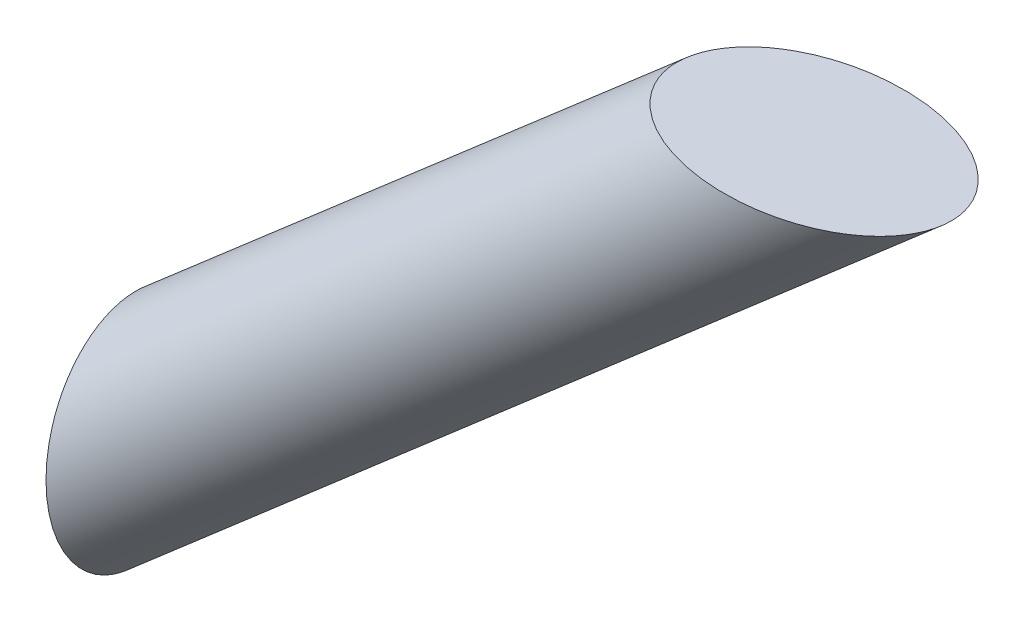
ISO-10303-21;
HEADER;
FILE_DESCRIPTION(('STEP AP214'),'2;1');
FILE_NAME('part.step','',(''),(''),'','','');
FILE_SCHEMA(('AUTOMOTIVE_DESIGN { 1 0 10303 214 1 1 1 1 }'));
ENDSEC;
DATA;
#1=APPLICATION_CONTEXT('core data for automotive mechanical design processes');
#2=APPLICATION_PROTOCOL_DEFINITION('international standard','automotive_design',2000,#1);
#3=PRODUCT_CONTEXT('',#1,'mechanical');
#4=PRODUCT('Part','Part','',(#3));
#5=PRODUCT_RELATED_PRODUCT_CATEGORY('part','',(#4));
#6=PRODUCT_DEFINITION_FORMATION('','',#4);
#7=PRODUCT_DEFINITION_CONTEXT('part definition',#1,'design');
#8=PRODUCT_DEFINITION('design','',#6,#7);
#9=PRODUCT_DEFINITION_SHAPE('','',#8);
#10=(LENGTH_UNIT() NAMED_UNIT(*) SI_UNIT(.MILLI.,.METRE.));
#11=(NAMED_UNIT(*) PLANE_ANGLE_UNIT() SI_UNIT($,.RADIAN.));
#12=(NAMED_UNIT(*) SI_UNIT($,.STERADIAN.) SOLID_ANGLE_UNIT());
#13=UNCERTAINTY_MEASURE_WITH_UNIT(LENGTH_MEASURE(1.E-05),#10,'distance_accuracy_value','');
#14=(GEOMETRIC_REPRESENTATION_CONTEXT(3) GLOBAL_UNCERTAINTY_ASSIGNED_CONTEXT((#13)) GLOBAL_UNIT_ASSIGNED_CONTEXT((#10,
#11,#12)) REPRESENTATION_CONTEXT('',''));
#15=CARTESIAN_POINT('',(0.,0.,0.));
#16=DIRECTION('',(0.,0.,1.));
#17=DIRECTION('',(1.,0.,0.));
#18=AXIS2_PLACEMENT_3D('',#15,#16,#17);
#19=CARTESIAN_POINT('',(135.605846102533,117.011064529945,0.));
#20=DIRECTION('',(0.755885429780003,0.654703915557483,0.));
#21=DIRECTION('',(-0.654703915557483,0.755885429780003,0.));
#22=AXIS2_PLACEMENT_3D('',#19,#20,#21);
#23=CYLINDRICAL_SURFACE('',#22,25.4);
#24=CARTESIAN_POINT('',(-78.1585534392525,-68.1392027897119,0.));
#25=DIRECTION('',(1.,0.,0.));
#26=DIRECTION('',(0.,1.,0.));
#27=AXIS2_PLACEMENT_3D('',#24,#25,#26);
#28=ELLIPSE('',#27,33.6029760586767,25.4);
#29=CARTESIAN_POINT('',(-78.1585534392525,-34.5362267310352,0.));
#30=VERTEX_POINT('',#29);
#31=EDGE_CURVE('E44',#30,#30,#28,.F.);
#32=ORIENTED_EDGE('',*,*,#31,.F.);
#33=EDGE_LOOP('',(#32));
#34=FACE_BOUND('',#33,.T.);
#35=CARTESIAN_POINT('',(113.439162289948,97.8115746135324,0.));
#36=DIRECTION('',(0.,-1.,0.));
#37=DIRECTION('',(1.,0.,0.));
#38=AXIS2_PLACEMENT_3D('',#35,#36,#37);
#39=ELLIPSE('',#38,38.7961632677449,25.4);
#40=CARTESIAN_POINT('',(152.235325557693,97.8115746135324,0.));
#41=VERTEX_POINT('',#40);
#42=EDGE_CURVE('E10',#41,#41,#39,.F.);
#43=ORIENTED_EDGE('',*,*,#42,.F.);
#44=EDGE_LOOP('',(#43));
#45=FACE_BOUND('',#44,.T.);
#46=ADVANCED_FACE('F37',(#34,#45),#23,.T.);
#47=CARTESIAN_POINT('',(180.039707564178,97.8115746135324,-25.4));
#48=DIRECTION('',(0.,-1.,0.));
#49=DIRECTION('',(1.,0.,0.));
#50=AXIS2_PLACEMENT_3D('',#47,#48,#49);
#51=PLANE('',#50);
#52=ORIENTED_EDGE('',*,*,#42,.T.);
#53=EDGE_LOOP('',(#52));
#54=FACE_BOUND('',#53,.T.);
#55=ADVANCED_FACE('F55',(#54),#51,.F.);
#56=CARTESIAN_POINT('',(-78.1585534392525,-101.742178848389,-25.4));
#57=DIRECTION('',(1.,0.,0.));
#58=DIRECTION('',(0.,0.,-1.));
#59=AXIS2_PLACEMENT_3D('',#56,#57,#58);
#60=PLANE('',#59);
#61=ORIENTED_EDGE('',*,*,#31,.T.);
#62=EDGE_LOOP('',(#61));
#63=FACE_BOUND('',#62,.T.);
#64=ADVANCED_FACE('F51',(#63),#60,.F.);
#65=CLOSED_SHELL('',(#46,#55,#64));
#66=MANIFOLD_SOLID_BREP('B2',#65);
#67=ADVANCED_BREP_SHAPE_REPRESENTATION('',(#18,#66),#14);
#68=SHAPE_DEFINITION_REPRESENTATION(#9,#67);
ENDSEC;
END-ISO-10303-21;
